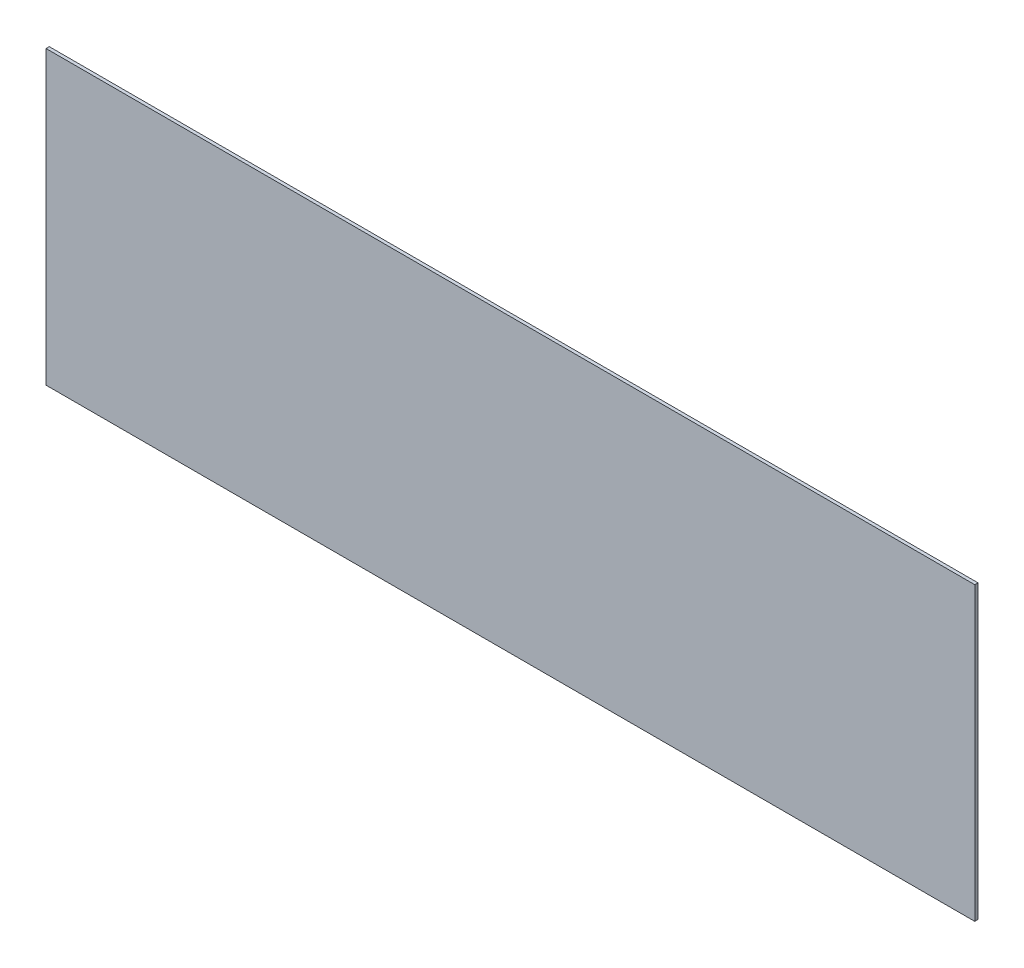
ISO-10303-21;
HEADER;
FILE_DESCRIPTION(('STEP AP214'),'2;1');
FILE_NAME('part.step','',(''),(''),'','','');
FILE_SCHEMA(('AUTOMOTIVE_DESIGN { 1 0 10303 214 1 1 1 1 }'));
ENDSEC;
DATA;
#1=APPLICATION_CONTEXT('core data for automotive mechanical design processes');
#2=APPLICATION_PROTOCOL_DEFINITION('international standard','automotive_design',2000,#1);
#3=PRODUCT_CONTEXT('',#1,'mechanical');
#4=PRODUCT('Part','Part','',(#3));
#5=PRODUCT_RELATED_PRODUCT_CATEGORY('part','',(#4));
#6=PRODUCT_DEFINITION_FORMATION('','',#4);
#7=PRODUCT_DEFINITION_CONTEXT('part definition',#1,'design');
#8=PRODUCT_DEFINITION('design','',#6,#7);
#9=PRODUCT_DEFINITION_SHAPE('','',#8);
#10=(LENGTH_UNIT() NAMED_UNIT(*) SI_UNIT(.MILLI.,.METRE.));
#11=(NAMED_UNIT(*) PLANE_ANGLE_UNIT() SI_UNIT($,.RADIAN.));
#12=(NAMED_UNIT(*) SI_UNIT($,.STERADIAN.) SOLID_ANGLE_UNIT());
#13=UNCERTAINTY_MEASURE_WITH_UNIT(LENGTH_MEASURE(1.E-05),#10,'distance_accuracy_value','');
#14=(GEOMETRIC_REPRESENTATION_CONTEXT(3) GLOBAL_UNCERTAINTY_ASSIGNED_CONTEXT((#13)) GLOBAL_UNIT_ASSIGNED_CONTEXT((#10,
#11,#12)) REPRESENTATION_CONTEXT('',''));
#15=CARTESIAN_POINT('',(0.,0.,0.));
#16=DIRECTION('',(0.,0.,1.));
#17=DIRECTION('',(1.,0.,0.));
#18=AXIS2_PLACEMENT_3D('',#15,#16,#17);
#19=CARTESIAN_POINT('',(430.,-135.,3.));
#20=DIRECTION('',(-1.,0.,0.));
#21=DIRECTION('',(0.,0.,1.));
#22=AXIS2_PLACEMENT_3D('',#19,#20,#21);
#23=PLANE('',#22);
#24=DIRECTION('',(0.,1.,0.));
#25=VECTOR('',#24,1.);
#26=CARTESIAN_POINT('',(430.,-135.,0.));
#27=LINE('',#26,#25);
#28=CARTESIAN_POINT('',(430.,-135.,0.));
#29=VERTEX_POINT('',#28);
#30=CARTESIAN_POINT('',(430.,135.,0.));
#31=VERTEX_POINT('',#30);
#32=EDGE_CURVE('E96',#29,#31,#27,.T.);
#33=ORIENTED_EDGE('',*,*,#32,.T.);
#34=DIRECTION('',(0.,0.,-1.));
#35=VECTOR('',#34,1.);
#36=CARTESIAN_POINT('',(430.,135.,3.));
#37=LINE('',#36,#35);
#38=CARTESIAN_POINT('',(430.,135.,3.));
#39=VERTEX_POINT('',#38);
#40=EDGE_CURVE('E11',#39,#31,#37,.T.);
#41=ORIENTED_EDGE('',*,*,#40,.F.);
#42=DIRECTION('',(0.,1.,0.));
#43=VECTOR('',#42,1.);
#44=CARTESIAN_POINT('',(430.,-135.,3.));
#45=LINE('',#44,#43);
#46=CARTESIAN_POINT('',(430.,-135.,3.));
#47=VERTEX_POINT('',#46);
#48=EDGE_CURVE('E84',#47,#39,#45,.T.);
#49=ORIENTED_EDGE('',*,*,#48,.F.);
#50=DIRECTION('',(0.,0.,-1.));
#51=VECTOR('',#50,1.);
#52=CARTESIAN_POINT('',(430.,-135.,3.));
#53=LINE('',#52,#51);
#54=EDGE_CURVE('E92',#47,#29,#53,.T.);
#55=ORIENTED_EDGE('',*,*,#54,.T.);
#56=EDGE_LOOP('',(#33,#41,#49,#55));
#57=FACE_BOUND('',#56,.T.);
#58=ADVANCED_FACE('F33',(#57),#23,.F.);
#59=CARTESIAN_POINT('',(-430.,135.,3.));
#60=DIRECTION('',(0.,-1.,0.));
#61=DIRECTION('',(0.,0.,-1.));
#62=AXIS2_PLACEMENT_3D('',#59,#60,#61);
#63=PLANE('',#62);
#64=DIRECTION('',(-1.,0.,0.));
#65=VECTOR('',#64,1.);
#66=CARTESIAN_POINT('',(-430.,135.,0.));
#67=LINE('',#66,#65);
#68=CARTESIAN_POINT('',(-430.,135.,0.));
#69=VERTEX_POINT('',#68);
#70=EDGE_CURVE('E88',#31,#69,#67,.T.);
#71=ORIENTED_EDGE('',*,*,#70,.T.);
#72=DIRECTION('',(0.,0.,-1.));
#73=VECTOR('',#72,1.);
#74=CARTESIAN_POINT('',(-430.,135.,3.));
#75=LINE('',#74,#73);
#76=CARTESIAN_POINT('',(-430.,135.,3.));
#77=VERTEX_POINT('',#76);
#78=EDGE_CURVE('E41',#77,#69,#75,.T.);
#79=ORIENTED_EDGE('',*,*,#78,.F.);
#80=DIRECTION('',(-1.,0.,0.));
#81=VECTOR('',#80,1.);
#82=CARTESIAN_POINT('',(-430.,135.,3.));
#83=LINE('',#82,#81);
#84=EDGE_CURVE('E79',#39,#77,#83,.T.);
#85=ORIENTED_EDGE('',*,*,#84,.F.);
#86=ORIENTED_EDGE('',*,*,#40,.T.);
#87=EDGE_LOOP('',(#71,#79,#85,#86));
#88=FACE_BOUND('',#87,.T.);
#89=ADVANCED_FACE('F87',(#88),#63,.F.);
#90=CARTESIAN_POINT('',(-430.,-135.,3.));
#91=DIRECTION('',(1.,0.,0.));
#92=DIRECTION('',(0.,0.,-1.));
#93=AXIS2_PLACEMENT_3D('',#90,#91,#92);
#94=PLANE('',#93);
#95=DIRECTION('',(0.,-1.,0.));
#96=VECTOR('',#95,1.);
#97=CARTESIAN_POINT('',(-430.,-135.,0.));
#98=LINE('',#97,#96);
#99=CARTESIAN_POINT('',(-430.,-135.,0.));
#100=VERTEX_POINT('',#99);
#101=EDGE_CURVE('E66',#69,#100,#98,.T.);
#102=ORIENTED_EDGE('',*,*,#101,.T.);
#103=DIRECTION('',(0.,0.,-1.));
#104=VECTOR('',#103,1.);
#105=CARTESIAN_POINT('',(-430.,-135.,3.));
#106=LINE('',#105,#104);
#107=CARTESIAN_POINT('',(-430.,-135.,3.));
#108=VERTEX_POINT('',#107);
#109=EDGE_CURVE('E89',#108,#100,#106,.T.);
#110=ORIENTED_EDGE('',*,*,#109,.F.);
#111=DIRECTION('',(0.,-1.,0.));
#112=VECTOR('',#111,1.);
#113=CARTESIAN_POINT('',(-430.,-135.,3.));
#114=LINE('',#113,#112);
#115=EDGE_CURVE('E82',#77,#108,#114,.T.);
#116=ORIENTED_EDGE('',*,*,#115,.F.);
#117=ORIENTED_EDGE('',*,*,#78,.T.);
#118=EDGE_LOOP('',(#102,#110,#116,#117));
#119=FACE_BOUND('',#118,.T.);
#120=ADVANCED_FACE('F90',(#119),#94,.F.);
#121=CARTESIAN_POINT('',(-430.,-135.,3.));
#122=DIRECTION('',(0.,1.,0.));
#123=DIRECTION('',(0.,0.,1.));
#124=AXIS2_PLACEMENT_3D('',#121,#122,#123);
#125=PLANE('',#124);
#126=DIRECTION('',(1.,0.,0.));
#127=VECTOR('',#126,1.);
#128=CARTESIAN_POINT('',(-430.,-135.,0.));
#129=LINE('',#128,#127);
#130=EDGE_CURVE('E72',#100,#29,#129,.T.);
#131=ORIENTED_EDGE('',*,*,#130,.T.);
#132=ORIENTED_EDGE('',*,*,#54,.F.);
#133=DIRECTION('',(1.,0.,0.));
#134=VECTOR('',#133,1.);
#135=CARTESIAN_POINT('',(-430.,-135.,3.));
#136=LINE('',#135,#134);
#137=EDGE_CURVE('E49',#108,#47,#136,.T.);
#138=ORIENTED_EDGE('',*,*,#137,.F.);
#139=ORIENTED_EDGE('',*,*,#109,.T.);
#140=EDGE_LOOP('',(#131,#132,#138,#139));
#141=FACE_BOUND('',#140,.T.);
#142=ADVANCED_FACE('F103',(#141),#125,.F.);
#143=CARTESIAN_POINT('',(0.,0.,3.));
#144=DIRECTION('',(0.,0.,-1.));
#145=DIRECTION('',(-1.,0.,0.));
#146=AXIS2_PLACEMENT_3D('',#143,#144,#145);
#147=PLANE('',#146);
#148=ORIENTED_EDGE('',*,*,#48,.T.);
#149=ORIENTED_EDGE('',*,*,#84,.T.);
#150=ORIENTED_EDGE('',*,*,#115,.T.);
#151=ORIENTED_EDGE('',*,*,#137,.T.);
#152=EDGE_LOOP('',(#148,#149,#150,#151));
#153=FACE_BOUND('',#152,.T.);
#154=ADVANCED_FACE('F80',(#153),#147,.F.);
#155=CARTESIAN_POINT('',(0.,0.,0.));
#156=DIRECTION('',(0.,0.,-1.));
#157=DIRECTION('',(-1.,0.,0.));
#158=AXIS2_PLACEMENT_3D('',#155,#156,#157);
#159=PLANE('',#158);
#160=ORIENTED_EDGE('',*,*,#32,.F.);
#161=ORIENTED_EDGE('',*,*,#130,.F.);
#162=ORIENTED_EDGE('',*,*,#101,.F.);
#163=ORIENTED_EDGE('',*,*,#70,.F.);
#164=EDGE_LOOP('',(#160,#161,#162,#163));
#165=FACE_BOUND('',#164,.T.);
#166=ADVANCED_FACE('F106',(#165),#159,.T.);
#167=CLOSED_SHELL('',(#58,#89,#120,#142,#154,#166));
#168=MANIFOLD_SOLID_BREP('B2',#167);
#169=ADVANCED_BREP_SHAPE_REPRESENTATION('',(#18,#168),#14);
#170=SHAPE_DEFINITION_REPRESENTATION(#9,#169);
ENDSEC;
END-ISO-10303-21;
